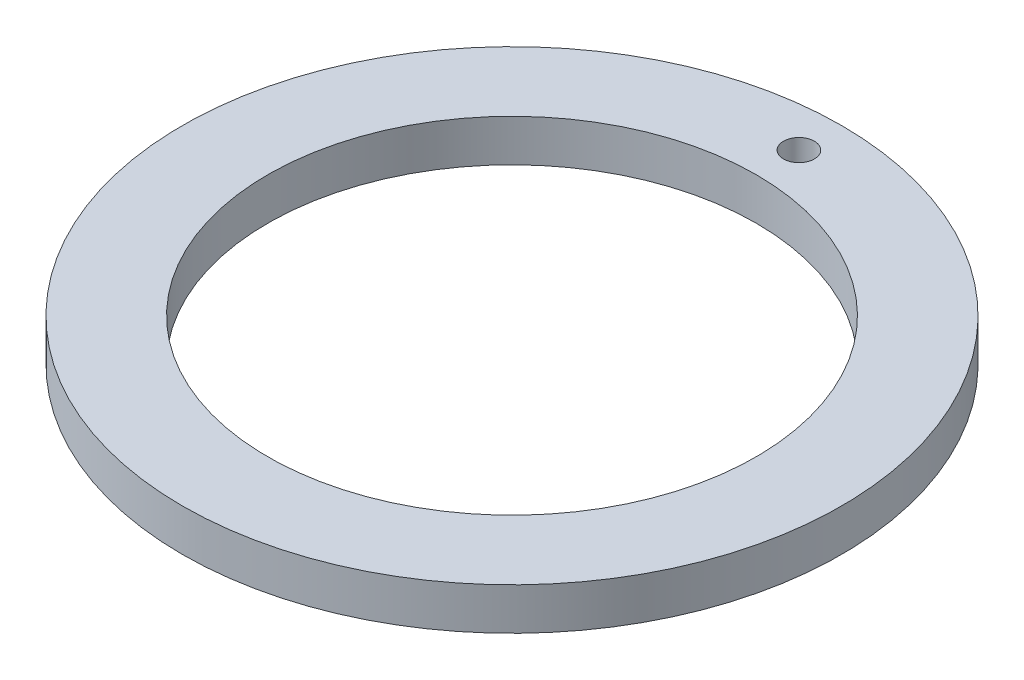
ISO-10303-21;
HEADER;
FILE_DESCRIPTION(('STEP AP214'),'2;1');
FILE_NAME('part.step','',(''),(''),'','','');
FILE_SCHEMA(('AUTOMOTIVE_DESIGN { 1 0 10303 214 1 1 1 1 }'));
ENDSEC;
DATA;
#1=APPLICATION_CONTEXT('core data for automotive mechanical design processes');
#2=APPLICATION_PROTOCOL_DEFINITION('international standard','automotive_design',2000,#1);
#3=PRODUCT_CONTEXT('',#1,'mechanical');
#4=PRODUCT('Part','Part','',(#3));
#5=PRODUCT_RELATED_PRODUCT_CATEGORY('part','',(#4));
#6=PRODUCT_DEFINITION_FORMATION('','',#4);
#7=PRODUCT_DEFINITION_CONTEXT('part definition',#1,'design');
#8=PRODUCT_DEFINITION('design','',#6,#7);
#9=PRODUCT_DEFINITION_SHAPE('','',#8);
#10=(LENGTH_UNIT() NAMED_UNIT(*) SI_UNIT(.MILLI.,.METRE.));
#11=(NAMED_UNIT(*) PLANE_ANGLE_UNIT() SI_UNIT($,.RADIAN.));
#12=(NAMED_UNIT(*) SI_UNIT($,.STERADIAN.) SOLID_ANGLE_UNIT());
#13=UNCERTAINTY_MEASURE_WITH_UNIT(LENGTH_MEASURE(1.E-05),#10,'distance_accuracy_value','');
#14=(GEOMETRIC_REPRESENTATION_CONTEXT(3) GLOBAL_UNCERTAINTY_ASSIGNED_CONTEXT((#13)) GLOBAL_UNIT_ASSIGNED_CONTEXT((#10,
#11,#12)) REPRESENTATION_CONTEXT('',''));
#15=CARTESIAN_POINT('',(0.,0.,0.));
#16=DIRECTION('',(0.,0.,1.));
#17=DIRECTION('',(1.,0.,0.));
#18=AXIS2_PLACEMENT_3D('',#15,#16,#17);
#19=CARTESIAN_POINT('',(0.,6.477,0.));
#20=DIRECTION('',(0.,-1.,0.));
#21=DIRECTION('',(0.,0.,-1.));
#22=AXIS2_PLACEMENT_3D('',#19,#20,#21);
#23=CYLINDRICAL_SURFACE('',#22,50.8);
#24=CARTESIAN_POINT('',(0.,6.477,0.));
#25=DIRECTION('',(0.,1.,0.));
#26=DIRECTION('',(0.,0.,1.));
#27=AXIS2_PLACEMENT_3D('',#24,#25,#26);
#28=CIRCLE('',#27,50.8);
#29=CARTESIAN_POINT('',(0.,6.477,50.8));
#30=VERTEX_POINT('',#29);
#31=EDGE_CURVE('E10',#30,#30,#28,.T.);
#32=ORIENTED_EDGE('',*,*,#31,.F.);
#33=EDGE_LOOP('',(#32));
#34=FACE_BOUND('',#33,.T.);
#35=CARTESIAN_POINT('',(0.,0.,0.));
#36=DIRECTION('',(0.,1.,0.));
#37=DIRECTION('',(0.,0.,1.));
#38=AXIS2_PLACEMENT_3D('',#35,#36,#37);
#39=CIRCLE('',#38,50.8);
#40=CARTESIAN_POINT('',(0.,0.,50.8));
#41=VERTEX_POINT('',#40);
#42=EDGE_CURVE('E38',#41,#41,#39,.T.);
#43=ORIENTED_EDGE('',*,*,#42,.T.);
#44=EDGE_LOOP('',(#43));
#45=FACE_BOUND('',#44,.T.);
#46=ADVANCED_FACE('F35',(#34,#45),#23,.T.);
#47=CARTESIAN_POINT('',(0.,6.477,0.));
#48=DIRECTION('',(0.,1.,0.));
#49=DIRECTION('',(0.,0.,1.));
#50=AXIS2_PLACEMENT_3D('',#47,#48,#49);
#51=PLANE('',#50);
#52=CARTESIAN_POINT('',(0.,6.477,-44.22775));
#53=DIRECTION('',(0.,-1.,0.));
#54=DIRECTION('',(0.,0.,-1.));
#55=AXIS2_PLACEMENT_3D('',#52,#53,#54);
#56=CIRCLE('',#55,2.38125);
#57=CARTESIAN_POINT('',(0.,6.477,-46.609));
#58=VERTEX_POINT('',#57);
#59=EDGE_CURVE('E50',#58,#58,#56,.T.);
#60=ORIENTED_EDGE('',*,*,#59,.T.);
#61=EDGE_LOOP('',(#60));
#62=FACE_BOUND('',#61,.T.);
#63=CARTESIAN_POINT('',(0.,6.477,0.));
#64=DIRECTION('',(0.,-1.,0.));
#65=DIRECTION('',(0.,0.,-1.));
#66=AXIS2_PLACEMENT_3D('',#63,#64,#65);
#67=CIRCLE('',#66,37.6555);
#68=CARTESIAN_POINT('',(0.,6.477,-37.6555));
#69=VERTEX_POINT('',#68);
#70=EDGE_CURVE('E45',#69,#69,#67,.T.);
#71=ORIENTED_EDGE('',*,*,#70,.T.);
#72=EDGE_LOOP('',(#71));
#73=FACE_BOUND('',#72,.T.);
#74=ORIENTED_EDGE('',*,*,#31,.T.);
#75=EDGE_LOOP('',(#74));
#76=FACE_BOUND('',#75,.T.);
#77=ADVANCED_FACE('F59',(#62,#73,#76),#51,.T.);
#78=CARTESIAN_POINT('',(0.,0.,0.));
#79=DIRECTION('',(0.,1.,0.));
#80=DIRECTION('',(0.,0.,1.));
#81=AXIS2_PLACEMENT_3D('',#78,#79,#80);
#82=PLANE('',#81);
#83=CARTESIAN_POINT('',(0.,0.,-44.22775));
#84=DIRECTION('',(0.,-1.,0.));
#85=DIRECTION('',(0.,0.,-1.));
#86=AXIS2_PLACEMENT_3D('',#83,#84,#85);
#87=CIRCLE('',#86,2.38125);
#88=CARTESIAN_POINT('',(0.,0.,-46.609));
#89=VERTEX_POINT('',#88);
#90=EDGE_CURVE('E53',#89,#89,#87,.T.);
#91=ORIENTED_EDGE('',*,*,#90,.F.);
#92=EDGE_LOOP('',(#91));
#93=FACE_BOUND('',#92,.T.);
#94=CARTESIAN_POINT('',(0.,0.,0.));
#95=DIRECTION('',(0.,-1.,0.));
#96=DIRECTION('',(0.,0.,-1.));
#97=AXIS2_PLACEMENT_3D('',#94,#95,#96);
#98=CIRCLE('',#97,37.6555);
#99=CARTESIAN_POINT('',(0.,0.,-37.6555));
#100=VERTEX_POINT('',#99);
#101=EDGE_CURVE('E47',#100,#100,#98,.T.);
#102=ORIENTED_EDGE('',*,*,#101,.F.);
#103=EDGE_LOOP('',(#102));
#104=FACE_BOUND('',#103,.T.);
#105=ORIENTED_EDGE('',*,*,#42,.F.);
#106=EDGE_LOOP('',(#105));
#107=FACE_BOUND('',#106,.T.);
#108=ADVANCED_FACE('F69',(#93,#104,#107),#82,.F.);
#109=CARTESIAN_POINT('',(0.,6.477,0.));
#110=DIRECTION('',(0.,-1.,0.));
#111=DIRECTION('',(0.,0.,-1.));
#112=AXIS2_PLACEMENT_3D('',#109,#110,#111);
#113=CYLINDRICAL_SURFACE('',#112,37.6555);
#114=ORIENTED_EDGE('',*,*,#70,.F.);
#115=EDGE_LOOP('',(#114));
#116=FACE_BOUND('',#115,.T.);
#117=ORIENTED_EDGE('',*,*,#101,.T.);
#118=EDGE_LOOP('',(#117));
#119=FACE_BOUND('',#118,.T.);
#120=ADVANCED_FACE('F65',(#116,#119),#113,.F.);
#121=CARTESIAN_POINT('',(0.,6.477,-44.22775));
#122=DIRECTION('',(0.,-1.,0.));
#123=DIRECTION('',(0.,0.,-1.));
#124=AXIS2_PLACEMENT_3D('',#121,#122,#123);
#125=CYLINDRICAL_SURFACE('',#124,2.38125);
#126=ORIENTED_EDGE('',*,*,#59,.F.);
#127=EDGE_LOOP('',(#126));
#128=FACE_BOUND('',#127,.T.);
#129=ORIENTED_EDGE('',*,*,#90,.T.);
#130=EDGE_LOOP('',(#129));
#131=FACE_BOUND('',#130,.T.);
#132=ADVANCED_FACE('F62',(#128,#131),#125,.F.);
#133=CLOSED_SHELL('',(#46,#77,#108,#120,#132));
#134=MANIFOLD_SOLID_BREP('B2',#133);
#135=ADVANCED_BREP_SHAPE_REPRESENTATION('',(#18,#134),#14);
#136=SHAPE_DEFINITION_REPRESENTATION(#9,#135);
ENDSEC;
END-ISO-10303-21;
